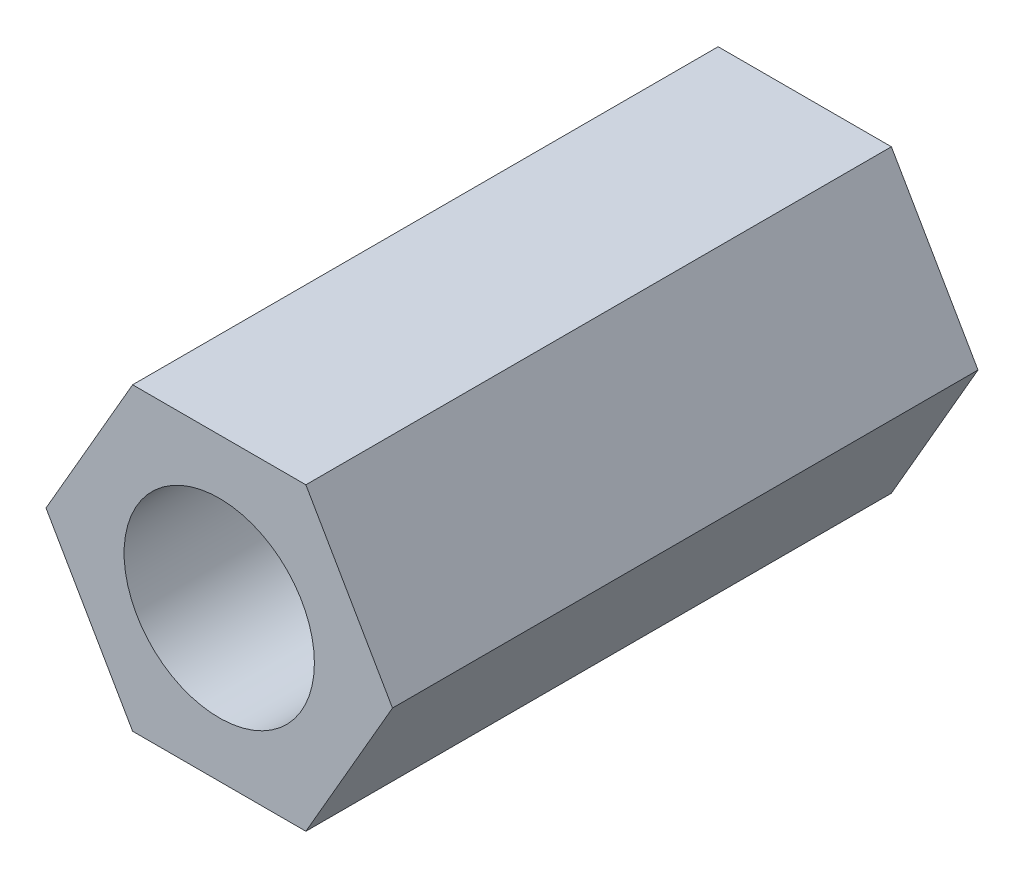
ISO-10303-21;
HEADER;
FILE_DESCRIPTION(('STEP AP214'),'2;1');
FILE_NAME('part.step','',(''),(''),'','','');
FILE_SCHEMA(('AUTOMOTIVE_DESIGN { 1 0 10303 214 1 1 1 1 }'));
ENDSEC;
DATA;
#1=APPLICATION_CONTEXT('core data for automotive mechanical design processes');
#2=APPLICATION_PROTOCOL_DEFINITION('international standard','automotive_design',2000,#1);
#3=PRODUCT_CONTEXT('',#1,'mechanical');
#4=PRODUCT('Part','Part','',(#3));
#5=PRODUCT_RELATED_PRODUCT_CATEGORY('part','',(#4));
#6=PRODUCT_DEFINITION_FORMATION('','',#4);
#7=PRODUCT_DEFINITION_CONTEXT('part definition',#1,'design');
#8=PRODUCT_DEFINITION('design','',#6,#7);
#9=PRODUCT_DEFINITION_SHAPE('','',#8);
#10=(LENGTH_UNIT() NAMED_UNIT(*) SI_UNIT(.MILLI.,.METRE.));
#11=(NAMED_UNIT(*) PLANE_ANGLE_UNIT() SI_UNIT($,.RADIAN.));
#12=(NAMED_UNIT(*) SI_UNIT($,.STERADIAN.) SOLID_ANGLE_UNIT());
#13=UNCERTAINTY_MEASURE_WITH_UNIT(LENGTH_MEASURE(1.E-05),#10,'distance_accuracy_value','');
#14=(GEOMETRIC_REPRESENTATION_CONTEXT(3) GLOBAL_UNCERTAINTY_ASSIGNED_CONTEXT((#13)) GLOBAL_UNIT_ASSIGNED_CONTEXT((#10,
#11,#12)) REPRESENTATION_CONTEXT('',''));
#15=CARTESIAN_POINT('',(0.,0.,0.));
#16=DIRECTION('',(0.,0.,1.));
#17=DIRECTION('',(1.,0.,0.));
#18=AXIS2_PLACEMENT_3D('',#15,#16,#17);
#19=CARTESIAN_POINT('',(-11.8356805183873,20.5,80.));
#20=DIRECTION('',(0.866025403784438,-0.5,0.));
#21=DIRECTION('',(0.5,0.866025403784439,0.));
#22=AXIS2_PLACEMENT_3D('',#19,#20,#21);
#23=PLANE('',#22);
#24=DIRECTION('',(-0.5,-0.866025403784439,0.));
#25=VECTOR('',#24,1.);
#26=CARTESIAN_POINT('',(-11.8356805183873,20.5,0.));
#27=LINE('',#26,#25);
#28=CARTESIAN_POINT('',(-11.8356805183873,20.5,0.));
#29=VERTEX_POINT('',#28);
#30=CARTESIAN_POINT('',(-23.6713610367747,0.,0.));
#31=VERTEX_POINT('',#30);
#32=EDGE_CURVE('E121',#29,#31,#27,.T.);
#33=ORIENTED_EDGE('',*,*,#32,.T.);
#34=DIRECTION('',(0.,0.,-1.));
#35=VECTOR('',#34,1.);
#36=CARTESIAN_POINT('',(-23.6713610367747,0.,80.));
#37=LINE('',#36,#35);
#38=CARTESIAN_POINT('',(-23.6713610367747,0.,80.));
#39=VERTEX_POINT('',#38);
#40=EDGE_CURVE('E11',#39,#31,#37,.T.);
#41=ORIENTED_EDGE('',*,*,#40,.F.);
#42=DIRECTION('',(-0.5,-0.866025403784439,0.));
#43=VECTOR('',#42,1.);
#44=CARTESIAN_POINT('',(-11.8356805183873,20.5,80.));
#45=LINE('',#44,#43);
#46=CARTESIAN_POINT('',(-11.8356805183873,20.5,80.));
#47=VERTEX_POINT('',#46);
#48=EDGE_CURVE('E132',#47,#39,#45,.T.);
#49=ORIENTED_EDGE('',*,*,#48,.F.);
#50=DIRECTION('',(0.,0.,-1.));
#51=VECTOR('',#50,1.);
#52=CARTESIAN_POINT('',(-11.8356805183873,20.5,80.));
#53=LINE('',#52,#51);
#54=EDGE_CURVE('E117',#47,#29,#53,.T.);
#55=ORIENTED_EDGE('',*,*,#54,.T.);
#56=EDGE_LOOP('',(#33,#41,#49,#55));
#57=FACE_BOUND('',#56,.T.);
#58=ADVANCED_FACE('F37',(#57),#23,.F.);
#59=CARTESIAN_POINT('',(-23.6713610367747,0.,80.));
#60=DIRECTION('',(0.866025403784439,0.5,0.));
#61=DIRECTION('',(-0.5,0.866025403784439,0.));
#62=AXIS2_PLACEMENT_3D('',#59,#60,#61);
#63=PLANE('',#62);
#64=DIRECTION('',(0.5,-0.866025403784439,0.));
#65=VECTOR('',#64,1.);
#66=CARTESIAN_POINT('',(-23.6713610367747,0.,0.));
#67=LINE('',#66,#65);
#68=CARTESIAN_POINT('',(-11.8356805183873,-20.5,0.));
#69=VERTEX_POINT('',#68);
#70=EDGE_CURVE('E124',#31,#69,#67,.T.);
#71=ORIENTED_EDGE('',*,*,#70,.T.);
#72=DIRECTION('',(0.,0.,-1.));
#73=VECTOR('',#72,1.);
#74=CARTESIAN_POINT('',(-11.8356805183873,-20.5,80.));
#75=LINE('',#74,#73);
#76=CARTESIAN_POINT('',(-11.8356805183873,-20.5,80.));
#77=VERTEX_POINT('',#76);
#78=EDGE_CURVE('E45',#77,#69,#75,.T.);
#79=ORIENTED_EDGE('',*,*,#78,.F.);
#80=DIRECTION('',(0.5,-0.866025403784439,0.));
#81=VECTOR('',#80,1.);
#82=CARTESIAN_POINT('',(-23.6713610367747,0.,80.));
#83=LINE('',#82,#81);
#84=EDGE_CURVE('E90',#39,#77,#83,.T.);
#85=ORIENTED_EDGE('',*,*,#84,.F.);
#86=ORIENTED_EDGE('',*,*,#40,.T.);
#87=EDGE_LOOP('',(#71,#79,#85,#86));
#88=FACE_BOUND('',#87,.T.);
#89=ADVANCED_FACE('F157',(#88),#63,.F.);
#90=CARTESIAN_POINT('',(-11.8356805183873,-20.5,80.));
#91=DIRECTION('',(0.,1.,0.));
#92=DIRECTION('',(-1.,0.,0.));
#93=AXIS2_PLACEMENT_3D('',#90,#91,#92);
#94=PLANE('',#93);
#95=DIRECTION('',(1.,0.,0.));
#96=VECTOR('',#95,1.);
#97=CARTESIAN_POINT('',(-11.8356805183873,-20.5,0.));
#98=LINE('',#97,#96);
#99=CARTESIAN_POINT('',(11.8356805183873,-20.5,0.));
#100=VERTEX_POINT('',#99);
#101=EDGE_CURVE('E127',#69,#100,#98,.T.);
#102=ORIENTED_EDGE('',*,*,#101,.T.);
#103=DIRECTION('',(0.,0.,-1.));
#104=VECTOR('',#103,1.);
#105=CARTESIAN_POINT('',(11.8356805183873,-20.5,80.));
#106=LINE('',#105,#104);
#107=CARTESIAN_POINT('',(11.8356805183873,-20.5,80.));
#108=VERTEX_POINT('',#107);
#109=EDGE_CURVE('E112',#108,#100,#106,.T.);
#110=ORIENTED_EDGE('',*,*,#109,.F.);
#111=DIRECTION('',(1.,0.,0.));
#112=VECTOR('',#111,1.);
#113=CARTESIAN_POINT('',(-11.8356805183873,-20.5,80.));
#114=LINE('',#113,#112);
#115=EDGE_CURVE('E103',#77,#108,#114,.T.);
#116=ORIENTED_EDGE('',*,*,#115,.F.);
#117=ORIENTED_EDGE('',*,*,#78,.T.);
#118=EDGE_LOOP('',(#102,#110,#116,#117));
#119=FACE_BOUND('',#118,.T.);
#120=ADVANCED_FACE('F138',(#119),#94,.F.);
#121=CARTESIAN_POINT('',(11.8356805183873,-20.5,80.));
#122=DIRECTION('',(-0.866025403784439,0.5,0.));
#123=DIRECTION('',(-0.5,-0.866025403784439,0.));
#124=AXIS2_PLACEMENT_3D('',#121,#122,#123);
#125=PLANE('',#124);
#126=DIRECTION('',(0.5,0.866025403784439,0.));
#127=VECTOR('',#126,1.);
#128=CARTESIAN_POINT('',(11.8356805183873,-20.5,0.));
#129=LINE('',#128,#127);
#130=CARTESIAN_POINT('',(23.6713610367746,0.,0.));
#131=VERTEX_POINT('',#130);
#132=EDGE_CURVE('E111',#100,#131,#129,.T.);
#133=ORIENTED_EDGE('',*,*,#132,.T.);
#134=DIRECTION('',(0.,0.,-1.));
#135=VECTOR('',#134,1.);
#136=CARTESIAN_POINT('',(23.6713610367746,0.,80.));
#137=LINE('',#136,#135);
#138=CARTESIAN_POINT('',(23.6713610367746,0.,80.));
#139=VERTEX_POINT('',#138);
#140=EDGE_CURVE('E108',#139,#131,#137,.T.);
#141=ORIENTED_EDGE('',*,*,#140,.F.);
#142=DIRECTION('',(0.5,0.866025403784439,0.));
#143=VECTOR('',#142,1.);
#144=CARTESIAN_POINT('',(11.8356805183873,-20.5,80.));
#145=LINE('',#144,#143);
#146=EDGE_CURVE('E97',#108,#139,#145,.T.);
#147=ORIENTED_EDGE('',*,*,#146,.F.);
#148=ORIENTED_EDGE('',*,*,#109,.T.);
#149=EDGE_LOOP('',(#133,#141,#147,#148));
#150=FACE_BOUND('',#149,.T.);
#151=ADVANCED_FACE('F109',(#150),#125,.F.);
#152=CARTESIAN_POINT('',(23.6713610367746,0.,80.));
#153=DIRECTION('',(-0.866025403784439,-0.5,0.));
#154=DIRECTION('',(0.5,-0.866025403784439,0.));
#155=AXIS2_PLACEMENT_3D('',#152,#153,#154);
#156=PLANE('',#155);
#157=DIRECTION('',(-0.5,0.866025403784439,0.));
#158=VECTOR('',#157,1.);
#159=CARTESIAN_POINT('',(23.6713610367746,0.,0.));
#160=LINE('',#159,#158);
#161=CARTESIAN_POINT('',(11.8356805183873,20.5,0.));
#162=VERTEX_POINT('',#161);
#163=EDGE_CURVE('E76',#131,#162,#160,.T.);
#164=ORIENTED_EDGE('',*,*,#163,.T.);
#165=DIRECTION('',(0.,0.,-1.));
#166=VECTOR('',#165,1.);
#167=CARTESIAN_POINT('',(11.8356805183873,20.5,80.));
#168=LINE('',#167,#166);
#169=CARTESIAN_POINT('',(11.8356805183873,20.5,80.));
#170=VERTEX_POINT('',#169);
#171=EDGE_CURVE('E113',#170,#162,#168,.T.);
#172=ORIENTED_EDGE('',*,*,#171,.F.);
#173=DIRECTION('',(-0.5,0.866025403784439,0.));
#174=VECTOR('',#173,1.);
#175=CARTESIAN_POINT('',(23.6713610367746,0.,80.));
#176=LINE('',#175,#174);
#177=EDGE_CURVE('E101',#139,#170,#176,.T.);
#178=ORIENTED_EDGE('',*,*,#177,.F.);
#179=ORIENTED_EDGE('',*,*,#140,.T.);
#180=EDGE_LOOP('',(#164,#172,#178,#179));
#181=FACE_BOUND('',#180,.T.);
#182=ADVANCED_FACE('F115',(#181),#156,.F.);
#183=CARTESIAN_POINT('',(11.8356805183873,20.5,80.));
#184=DIRECTION('',(0.,-1.,0.));
#185=DIRECTION('',(1.,0.,0.));
#186=AXIS2_PLACEMENT_3D('',#183,#184,#185);
#187=PLANE('',#186);
#188=DIRECTION('',(-1.,0.,0.));
#189=VECTOR('',#188,1.);
#190=CARTESIAN_POINT('',(11.8356805183873,20.5,0.));
#191=LINE('',#190,#189);
#192=EDGE_CURVE('E82',#162,#29,#191,.T.);
#193=ORIENTED_EDGE('',*,*,#192,.T.);
#194=ORIENTED_EDGE('',*,*,#54,.F.);
#195=DIRECTION('',(-1.,0.,0.));
#196=VECTOR('',#195,1.);
#197=CARTESIAN_POINT('',(11.8356805183873,20.5,80.));
#198=LINE('',#197,#196);
#199=EDGE_CURVE('E53',#170,#47,#198,.T.);
#200=ORIENTED_EDGE('',*,*,#199,.F.);
#201=ORIENTED_EDGE('',*,*,#171,.T.);
#202=EDGE_LOOP('',(#193,#194,#200,#201));
#203=FACE_BOUND('',#202,.T.);
#204=ADVANCED_FACE('F145',(#203),#187,.F.);
#205=CARTESIAN_POINT('',(-23.6713610367747,0.,80.));
#206=DIRECTION('',(0.,0.,1.));
#207=DIRECTION('',(1.,0.,0.));
#208=AXIS2_PLACEMENT_3D('',#205,#206,#207);
#209=PLANE('',#208);
#210=CARTESIAN_POINT('',(0.,0.,80.));
#211=DIRECTION('',(0.,0.,1.));
#212=DIRECTION('',(1.,0.,0.));
#213=AXIS2_PLACEMENT_3D('',#210,#211,#212);
#214=CIRCLE('',#213,13.);
#215=CARTESIAN_POINT('',(13.,0.,80.));
#216=VERTEX_POINT('',#215);
#217=EDGE_CURVE('E234',#216,#216,#214,.T.);
#218=ORIENTED_EDGE('',*,*,#217,.F.);
#219=EDGE_LOOP('',(#218));
#220=FACE_BOUND('',#219,.T.);
#221=ORIENTED_EDGE('',*,*,#48,.T.);
#222=ORIENTED_EDGE('',*,*,#84,.T.);
#223=ORIENTED_EDGE('',*,*,#115,.T.);
#224=ORIENTED_EDGE('',*,*,#146,.T.);
#225=ORIENTED_EDGE('',*,*,#177,.T.);
#226=ORIENTED_EDGE('',*,*,#199,.T.);
#227=EDGE_LOOP('',(#221,#222,#223,#224,#225,#226));
#228=FACE_BOUND('',#227,.T.);
#229=ADVANCED_FACE('F99',(#220,#228),#209,.T.);
#230=CARTESIAN_POINT('',(-23.6713610367747,0.,0.));
#231=DIRECTION('',(0.,0.,1.));
#232=DIRECTION('',(1.,0.,0.));
#233=AXIS2_PLACEMENT_3D('',#230,#231,#232);
#234=PLANE('',#233);
#235=CARTESIAN_POINT('',(0.,0.,0.));
#236=DIRECTION('',(0.,0.,1.));
#237=DIRECTION('',(1.,0.,0.));
#238=AXIS2_PLACEMENT_3D('',#235,#236,#237);
#239=CIRCLE('',#238,11.1);
#240=CARTESIAN_POINT('',(11.1,0.,0.));
#241=VERTEX_POINT('',#240);
#242=EDGE_CURVE('E233',#241,#241,#239,.T.);
#243=ORIENTED_EDGE('',*,*,#242,.T.);
#244=EDGE_LOOP('',(#243));
#245=FACE_BOUND('',#244,.T.);
#246=ORIENTED_EDGE('',*,*,#32,.F.);
#247=ORIENTED_EDGE('',*,*,#192,.F.);
#248=ORIENTED_EDGE('',*,*,#163,.F.);
#249=ORIENTED_EDGE('',*,*,#132,.F.);
#250=ORIENTED_EDGE('',*,*,#101,.F.);
#251=ORIENTED_EDGE('',*,*,#70,.F.);
#252=EDGE_LOOP('',(#246,#247,#248,#249,#250,#251));
#253=FACE_BOUND('',#252,.T.);
#254=ADVANCED_FACE('F141',(#245,#253),#234,.F.);
#255=CARTESIAN_POINT('',(0.,0.,43.));
#256=DIRECTION('',(0.,0.,1.));
#257=DIRECTION('',(1.,0.,0.));
#258=AXIS2_PLACEMENT_3D('',#255,#256,#257);
#259=CYLINDRICAL_SURFACE('',#258,13.);
#260=CARTESIAN_POINT('',(0.,0.,43.));
#261=DIRECTION('',(0.,0.,1.));
#262=DIRECTION('',(1.,0.,0.));
#263=AXIS2_PLACEMENT_3D('',#260,#261,#262);
#264=CIRCLE('',#263,13.);
#265=CARTESIAN_POINT('',(13.,0.,43.));
#266=VERTEX_POINT('',#265);
#267=EDGE_CURVE('E125',#266,#266,#264,.T.);
#268=ORIENTED_EDGE('',*,*,#267,.F.);
#269=EDGE_LOOP('',(#268));
#270=FACE_BOUND('',#269,.T.);
#271=ORIENTED_EDGE('',*,*,#217,.T.);
#272=EDGE_LOOP('',(#271));
#273=FACE_BOUND('',#272,.T.);
#274=ADVANCED_FACE('F192',(#270,#273),#259,.F.);
#275=CARTESIAN_POINT('',(0.,0.,43.));
#276=DIRECTION('',(0.,0.,1.));
#277=DIRECTION('',(1.,0.,0.));
#278=AXIS2_PLACEMENT_3D('',#275,#276,#277);
#279=PLANE('',#278);
#280=CARTESIAN_POINT('',(0.,0.,43.));
#281=DIRECTION('',(0.,0.,1.));
#282=DIRECTION('',(1.,0.,0.));
#283=AXIS2_PLACEMENT_3D('',#280,#281,#282);
#284=CIRCLE('',#283,11.1);
#285=CARTESIAN_POINT('',(11.1,0.,43.));
#286=VERTEX_POINT('',#285);
#287=EDGE_CURVE('E230',#286,#286,#284,.T.);
#288=ORIENTED_EDGE('',*,*,#287,.F.);
#289=EDGE_LOOP('',(#288));
#290=FACE_BOUND('',#289,.T.);
#291=ORIENTED_EDGE('',*,*,#267,.T.);
#292=EDGE_LOOP('',(#291));
#293=FACE_BOUND('',#292,.T.);
#294=ADVANCED_FACE('F197',(#290,#293),#279,.T.);
#295=CARTESIAN_POINT('',(0.,0.,-20.));
#296=DIRECTION('',(0.,0.,1.));
#297=DIRECTION('',(1.,0.,0.));
#298=AXIS2_PLACEMENT_3D('',#295,#296,#297);
#299=CYLINDRICAL_SURFACE('',#298,11.1);
#300=ORIENTED_EDGE('',*,*,#287,.T.);
#301=EDGE_LOOP('',(#300));
#302=FACE_BOUND('',#301,.T.);
#303=ORIENTED_EDGE('',*,*,#242,.F.);
#304=EDGE_LOOP('',(#303));
#305=FACE_BOUND('',#304,.T.);
#306=ADVANCED_FACE('F213',(#302,#305),#299,.F.);
#307=CLOSED_SHELL('',(#58,#89,#120,#151,#182,#204,#229,#254,#274,#294,#306));
#308=MANIFOLD_SOLID_BREP('B2',#307);
#309=ADVANCED_BREP_SHAPE_REPRESENTATION('',(#18,#308),#14);
#310=SHAPE_DEFINITION_REPRESENTATION(#9,#309);
ENDSEC;
END-ISO-10303-21;
